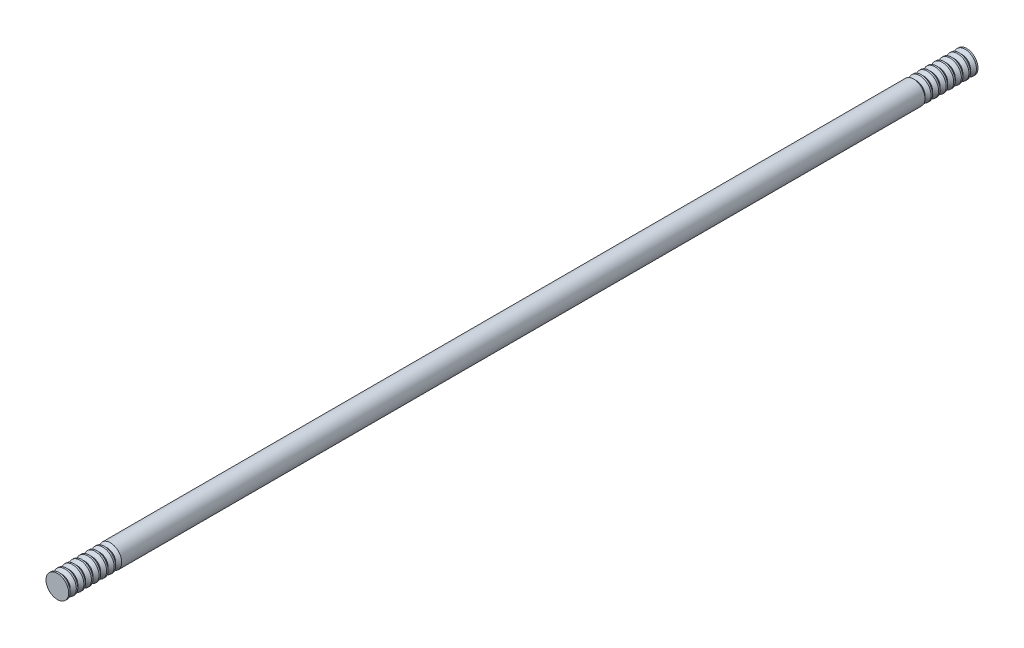
ISO-10303-21;
HEADER;
FILE_DESCRIPTION(('STEP AP214'),'2;1');
FILE_NAME('part.step','',(''),(''),'','','');
FILE_SCHEMA(('AUTOMOTIVE_DESIGN { 1 0 10303 214 1 1 1 1 }'));
ENDSEC;
DATA;
#1=APPLICATION_CONTEXT('core data for automotive mechanical design processes');
#2=APPLICATION_PROTOCOL_DEFINITION('international standard','automotive_design',2000,#1);
#3=PRODUCT_CONTEXT('',#1,'mechanical');
#4=PRODUCT('Part','Part','',(#3));
#5=PRODUCT_RELATED_PRODUCT_CATEGORY('part','',(#4));
#6=PRODUCT_DEFINITION_FORMATION('','',#4);
#7=PRODUCT_DEFINITION_CONTEXT('part definition',#1,'design');
#8=PRODUCT_DEFINITION('design','',#6,#7);
#9=PRODUCT_DEFINITION_SHAPE('','',#8);
#10=(LENGTH_UNIT() NAMED_UNIT(*) SI_UNIT(.MILLI.,.METRE.));
#11=(NAMED_UNIT(*) PLANE_ANGLE_UNIT() SI_UNIT($,.RADIAN.));
#12=(NAMED_UNIT(*) SI_UNIT($,.STERADIAN.) SOLID_ANGLE_UNIT());
#13=UNCERTAINTY_MEASURE_WITH_UNIT(LENGTH_MEASURE(1.E-05),#10,'distance_accuracy_value','');
#14=(GEOMETRIC_REPRESENTATION_CONTEXT(3) GLOBAL_UNCERTAINTY_ASSIGNED_CONTEXT((#13)) GLOBAL_UNIT_ASSIGNED_CONTEXT((#10,
#11,#12)) REPRESENTATION_CONTEXT('',''));
#15=CARTESIAN_POINT('',(0.,0.,0.));
#16=DIRECTION('',(0.,0.,1.));
#17=DIRECTION('',(1.,0.,0.));
#18=AXIS2_PLACEMENT_3D('',#15,#16,#17);
#19=CARTESIAN_POINT('',(0.,0.,60.));
#20=DIRECTION('',(0.,0.,-1.));
#21=DIRECTION('',(-1.,0.,0.));
#22=AXIS2_PLACEMENT_3D('',#19,#20,#21);
#23=CYLINDRICAL_SURFACE('',#22,1.5);
#24=CARTESIAN_POINT('',(0.,0.,53.));
#25=DIRECTION('',(0.,0.,1.));
#26=DIRECTION('',(1.,0.,0.));
#27=AXIS2_PLACEMENT_3D('',#24,#25,#26);
#28=CIRCLE('',#27,1.49999999999999);
#29=CARTESIAN_POINT('',(1.49999999999999,0.,53.));
#30=VERTEX_POINT('',#29);
#31=EDGE_CURVE('E164',#30,#30,#28,.T.);
#32=ORIENTED_EDGE('',*,*,#31,.F.);
#33=EDGE_LOOP('',(#32));
#34=FACE_BOUND('',#33,.T.);
#35=CARTESIAN_POINT('',(0.,0.,-53.));
#36=DIRECTION('',(0.,0.,1.));
#37=DIRECTION('',(1.,0.,0.));
#38=AXIS2_PLACEMENT_3D('',#35,#36,#37);
#39=CIRCLE('',#38,1.49999999999999);
#40=CARTESIAN_POINT('',(1.49999999999999,0.,-53.));
#41=VERTEX_POINT('',#40);
#42=EDGE_CURVE('E101',#41,#41,#39,.T.);
#43=ORIENTED_EDGE('',*,*,#42,.T.);
#44=EDGE_LOOP('',(#43));
#45=FACE_BOUND('',#44,.T.);
#46=ADVANCED_FACE('F35',(#34,#45),#23,.T.);
#47=CARTESIAN_POINT('',(0.,0.,-58.8));
#48=DIRECTION('',(0.,0.,1.));
#49=DIRECTION('',(1.,0.,0.));
#50=AXIS2_PLACEMENT_3D('',#47,#48,#49);
#51=CIRCLE('',#50,1.5);
#52=CARTESIAN_POINT('',(1.5,0.,-58.8));
#53=VERTEX_POINT('',#52);
#54=EDGE_CURVE('E62',#53,#53,#51,.T.);
#55=ORIENTED_EDGE('',*,*,#54,.F.);
#56=EDGE_LOOP('',(#55));
#57=FACE_BOUND('',#56,.T.);
#58=CARTESIAN_POINT('',(0.,0.,-59.));
#59=DIRECTION('',(0.,0.,1.));
#60=DIRECTION('',(1.,0.,0.));
#61=AXIS2_PLACEMENT_3D('',#58,#59,#60);
#62=CIRCLE('',#61,1.49999999999999);
#63=CARTESIAN_POINT('',(1.49999999999999,0.,-59.));
#64=VERTEX_POINT('',#63);
#65=EDGE_CURVE('E46',#64,#64,#62,.T.);
#66=ORIENTED_EDGE('',*,*,#65,.T.);
#67=EDGE_LOOP('',(#66));
#68=FACE_BOUND('',#67,.T.);
#69=ADVANCED_FACE('F193',(#57,#68),#23,.T.);
#70=CARTESIAN_POINT('',(0.,0.,-59.4));
#71=DIRECTION('',(0.,0.,1.));
#72=DIRECTION('',(1.,0.,0.));
#73=AXIS2_PLACEMENT_3D('',#70,#71,#72);
#74=CONICAL_SURFACE('',#73,1.1,0.78539816339742);
#75=ORIENTED_EDGE('',*,*,#65,.F.);
#76=EDGE_LOOP('',(#75));
#77=FACE_BOUND('',#76,.T.);
#78=CARTESIAN_POINT('',(0.,0.,-59.4));
#79=DIRECTION('',(0.,0.,1.));
#80=DIRECTION('',(1.,0.,0.));
#81=AXIS2_PLACEMENT_3D('',#78,#79,#80);
#82=CIRCLE('',#81,1.1);
#83=CARTESIAN_POINT('',(1.1,0.,-59.4));
#84=VERTEX_POINT('',#83);
#85=EDGE_CURVE('E50',#84,#84,#82,.T.);
#86=ORIENTED_EDGE('',*,*,#85,.T.);
#87=EDGE_LOOP('',(#86));
#88=FACE_BOUND('',#87,.T.);
#89=ADVANCED_FACE('F198',(#77,#88),#74,.T.);
#90=CARTESIAN_POINT('',(0.,0.,-59.8));
#91=DIRECTION('',(0.,0.,-1.));
#92=DIRECTION('',(-1.,0.,0.));
#93=AXIS2_PLACEMENT_3D('',#90,#91,#92);
#94=CONICAL_SURFACE('',#93,1.5,0.785398163397468);
#95=ORIENTED_EDGE('',*,*,#85,.F.);
#96=EDGE_LOOP('',(#95));
#97=FACE_BOUND('',#96,.T.);
#98=CARTESIAN_POINT('',(0.,0.,-59.8));
#99=DIRECTION('',(0.,0.,1.));
#100=DIRECTION('',(1.,0.,0.));
#101=AXIS2_PLACEMENT_3D('',#98,#99,#100);
#102=CIRCLE('',#101,1.5);
#103=CARTESIAN_POINT('',(1.5,0.,-59.8));
#104=VERTEX_POINT('',#103);
#105=EDGE_CURVE('E53',#104,#104,#102,.T.);
#106=ORIENTED_EDGE('',*,*,#105,.T.);
#107=EDGE_LOOP('',(#106));
#108=FACE_BOUND('',#107,.T.);
#109=ADVANCED_FACE('F217',(#97,#108),#94,.T.);
#110=CARTESIAN_POINT('',(0.,0.,-60.));
#111=DIRECTION('',(0.,0.,1.));
#112=DIRECTION('',(1.,0.,0.));
#113=AXIS2_PLACEMENT_3D('',#110,#111,#112);
#114=PLANE('',#113);
#115=CARTESIAN_POINT('',(0.,0.,-60.));
#116=DIRECTION('',(0.,0.,1.));
#117=DIRECTION('',(1.,0.,0.));
#118=AXIS2_PLACEMENT_3D('',#115,#116,#117);
#119=CIRCLE('',#118,1.5);
#120=CARTESIAN_POINT('',(1.5,0.,-60.));
#121=VERTEX_POINT('',#120);
#122=EDGE_CURVE('E39',#121,#121,#119,.T.);
#123=ORIENTED_EDGE('',*,*,#122,.F.);
#124=EDGE_LOOP('',(#123));
#125=FACE_BOUND('',#124,.T.);
#126=ADVANCED_FACE('F208',(#125),#114,.F.);
#127=ORIENTED_EDGE('',*,*,#105,.F.);
#128=EDGE_LOOP('',(#127));
#129=FACE_BOUND('',#128,.T.);
#130=ORIENTED_EDGE('',*,*,#122,.T.);
#131=EDGE_LOOP('',(#130));
#132=FACE_BOUND('',#131,.T.);
#133=ADVANCED_FACE('F37',(#129,#132),#23,.T.);
#134=CARTESIAN_POINT('',(0.,0.,-58.4));
#135=DIRECTION('',(0.,0.,1.));
#136=DIRECTION('',(1.,0.,0.));
#137=AXIS2_PLACEMENT_3D('',#134,#135,#136);
#138=CONICAL_SURFACE('',#137,1.1,0.78539816339742);
#139=CARTESIAN_POINT('',(0.,0.,-58.));
#140=DIRECTION('',(0.,0.,1.));
#141=DIRECTION('',(1.,0.,0.));
#142=AXIS2_PLACEMENT_3D('',#139,#140,#141);
#143=CIRCLE('',#142,1.49999999999999);
#144=CARTESIAN_POINT('',(1.49999999999999,0.,-58.));
#145=VERTEX_POINT('',#144);
#146=EDGE_CURVE('E56',#145,#145,#143,.T.);
#147=ORIENTED_EDGE('',*,*,#146,.F.);
#148=EDGE_LOOP('',(#147));
#149=FACE_BOUND('',#148,.T.);
#150=CARTESIAN_POINT('',(0.,0.,-58.4));
#151=DIRECTION('',(0.,0.,1.));
#152=DIRECTION('',(1.,0.,0.));
#153=AXIS2_PLACEMENT_3D('',#150,#151,#152);
#154=CIRCLE('',#153,1.1);
#155=CARTESIAN_POINT('',(1.1,0.,-58.4));
#156=VERTEX_POINT('',#155);
#157=EDGE_CURVE('E59',#156,#156,#154,.T.);
#158=ORIENTED_EDGE('',*,*,#157,.T.);
#159=EDGE_LOOP('',(#158));
#160=FACE_BOUND('',#159,.T.);
#161=ADVANCED_FACE('F207',(#149,#160),#138,.T.);
#162=CARTESIAN_POINT('',(0.,0.,-58.8));
#163=DIRECTION('',(0.,0.,-1.));
#164=DIRECTION('',(-1.,0.,0.));
#165=AXIS2_PLACEMENT_3D('',#162,#163,#164);
#166=CONICAL_SURFACE('',#165,1.5,0.785398163397468);
#167=ORIENTED_EDGE('',*,*,#157,.F.);
#168=EDGE_LOOP('',(#167));
#169=FACE_BOUND('',#168,.T.);
#170=ORIENTED_EDGE('',*,*,#54,.T.);
#171=EDGE_LOOP('',(#170));
#172=FACE_BOUND('',#171,.T.);
#173=ADVANCED_FACE('F214',(#169,#172),#166,.T.);
#174=CARTESIAN_POINT('',(0.,0.,-57.8));
#175=DIRECTION('',(0.,0.,1.));
#176=DIRECTION('',(1.,0.,0.));
#177=AXIS2_PLACEMENT_3D('',#174,#175,#176);
#178=CIRCLE('',#177,1.5);
#179=CARTESIAN_POINT('',(1.5,0.,-57.8));
#180=VERTEX_POINT('',#179);
#181=EDGE_CURVE('E71',#180,#180,#178,.T.);
#182=ORIENTED_EDGE('',*,*,#181,.F.);
#183=EDGE_LOOP('',(#182));
#184=FACE_BOUND('',#183,.T.);
#185=ORIENTED_EDGE('',*,*,#146,.T.);
#186=EDGE_LOOP('',(#185));
#187=FACE_BOUND('',#186,.T.);
#188=ADVANCED_FACE('F200',(#184,#187),#23,.T.);
#189=CARTESIAN_POINT('',(0.,0.,-57.4));
#190=DIRECTION('',(0.,0.,1.));
#191=DIRECTION('',(1.,0.,0.));
#192=AXIS2_PLACEMENT_3D('',#189,#190,#191);
#193=CONICAL_SURFACE('',#192,1.1,0.78539816339742);
#194=CARTESIAN_POINT('',(0.,0.,-57.));
#195=DIRECTION('',(0.,0.,1.));
#196=DIRECTION('',(1.,0.,0.));
#197=AXIS2_PLACEMENT_3D('',#194,#195,#196);
#198=CIRCLE('',#197,1.49999999999999);
#199=CARTESIAN_POINT('',(1.49999999999999,0.,-57.));
#200=VERTEX_POINT('',#199);
#201=EDGE_CURVE('E65',#200,#200,#198,.T.);
#202=ORIENTED_EDGE('',*,*,#201,.F.);
#203=EDGE_LOOP('',(#202));
#204=FACE_BOUND('',#203,.T.);
#205=CARTESIAN_POINT('',(0.,0.,-57.4));
#206=DIRECTION('',(0.,0.,1.));
#207=DIRECTION('',(1.,0.,0.));
#208=AXIS2_PLACEMENT_3D('',#205,#206,#207);
#209=CIRCLE('',#208,1.1);
#210=CARTESIAN_POINT('',(1.1,0.,-57.4));
#211=VERTEX_POINT('',#210);
#212=EDGE_CURVE('E68',#211,#211,#209,.T.);
#213=ORIENTED_EDGE('',*,*,#212,.T.);
#214=EDGE_LOOP('',(#213));
#215=FACE_BOUND('',#214,.T.);
#216=ADVANCED_FACE('F236',(#204,#215),#193,.T.);
#217=CARTESIAN_POINT('',(0.,0.,-57.8));
#218=DIRECTION('',(0.,0.,-1.));
#219=DIRECTION('',(-1.,0.,0.));
#220=AXIS2_PLACEMENT_3D('',#217,#218,#219);
#221=CONICAL_SURFACE('',#220,1.5,0.785398163397468);
#222=ORIENTED_EDGE('',*,*,#212,.F.);
#223=EDGE_LOOP('',(#222));
#224=FACE_BOUND('',#223,.T.);
#225=ORIENTED_EDGE('',*,*,#181,.T.);
#226=EDGE_LOOP('',(#225));
#227=FACE_BOUND('',#226,.T.);
#228=ADVANCED_FACE('F239',(#224,#227),#221,.T.);
#229=CARTESIAN_POINT('',(0.,0.,-56.8));
#230=DIRECTION('',(0.,0.,1.));
#231=DIRECTION('',(1.,0.,0.));
#232=AXIS2_PLACEMENT_3D('',#229,#230,#231);
#233=CIRCLE('',#232,1.5);
#234=CARTESIAN_POINT('',(1.5,0.,-56.8));
#235=VERTEX_POINT('',#234);
#236=EDGE_CURVE('E80',#235,#235,#233,.T.);
#237=ORIENTED_EDGE('',*,*,#236,.F.);
#238=EDGE_LOOP('',(#237));
#239=FACE_BOUND('',#238,.T.);
#240=ORIENTED_EDGE('',*,*,#201,.T.);
#241=EDGE_LOOP('',(#240));
#242=FACE_BOUND('',#241,.T.);
#243=ADVANCED_FACE('F243',(#239,#242),#23,.T.);
#244=CARTESIAN_POINT('',(0.,0.,-56.4));
#245=DIRECTION('',(0.,0.,1.));
#246=DIRECTION('',(1.,0.,0.));
#247=AXIS2_PLACEMENT_3D('',#244,#245,#246);
#248=CONICAL_SURFACE('',#247,1.1,0.78539816339742);
#249=CARTESIAN_POINT('',(0.,0.,-56.));
#250=DIRECTION('',(0.,0.,1.));
#251=DIRECTION('',(1.,0.,0.));
#252=AXIS2_PLACEMENT_3D('',#249,#250,#251);
#253=CIRCLE('',#252,1.49999999999999);
#254=CARTESIAN_POINT('',(1.49999999999999,0.,-56.));
#255=VERTEX_POINT('',#254);
#256=EDGE_CURVE('E74',#255,#255,#253,.T.);
#257=ORIENTED_EDGE('',*,*,#256,.F.);
#258=EDGE_LOOP('',(#257));
#259=FACE_BOUND('',#258,.T.);
#260=CARTESIAN_POINT('',(0.,0.,-56.4));
#261=DIRECTION('',(0.,0.,1.));
#262=DIRECTION('',(1.,0.,0.));
#263=AXIS2_PLACEMENT_3D('',#260,#261,#262);
#264=CIRCLE('',#263,1.1);
#265=CARTESIAN_POINT('',(1.1,0.,-56.4));
#266=VERTEX_POINT('',#265);
#267=EDGE_CURVE('E77',#266,#266,#264,.T.);
#268=ORIENTED_EDGE('',*,*,#267,.T.);
#269=EDGE_LOOP('',(#268));
#270=FACE_BOUND('',#269,.T.);
#271=ADVANCED_FACE('F245',(#259,#270),#248,.T.);
#272=CARTESIAN_POINT('',(0.,0.,-56.8));
#273=DIRECTION('',(0.,0.,-1.));
#274=DIRECTION('',(-1.,0.,0.));
#275=AXIS2_PLACEMENT_3D('',#272,#273,#274);
#276=CONICAL_SURFACE('',#275,1.5,0.785398163397468);
#277=ORIENTED_EDGE('',*,*,#267,.F.);
#278=EDGE_LOOP('',(#277));
#279=FACE_BOUND('',#278,.T.);
#280=ORIENTED_EDGE('',*,*,#236,.T.);
#281=EDGE_LOOP('',(#280));
#282=FACE_BOUND('',#281,.T.);
#283=ADVANCED_FACE('F248',(#279,#282),#276,.T.);
#284=CARTESIAN_POINT('',(0.,0.,-55.8));
#285=DIRECTION('',(0.,0.,1.));
#286=DIRECTION('',(1.,0.,0.));
#287=AXIS2_PLACEMENT_3D('',#284,#285,#286);
#288=CIRCLE('',#287,1.5);
#289=CARTESIAN_POINT('',(1.5,0.,-55.8));
#290=VERTEX_POINT('',#289);
#291=EDGE_CURVE('E89',#290,#290,#288,.T.);
#292=ORIENTED_EDGE('',*,*,#291,.F.);
#293=EDGE_LOOP('',(#292));
#294=FACE_BOUND('',#293,.T.);
#295=ORIENTED_EDGE('',*,*,#256,.T.);
#296=EDGE_LOOP('',(#295));
#297=FACE_BOUND('',#296,.T.);
#298=ADVANCED_FACE('F252',(#294,#297),#23,.T.);
#299=CARTESIAN_POINT('',(0.,0.,-55.4));
#300=DIRECTION('',(0.,0.,1.));
#301=DIRECTION('',(1.,0.,0.));
#302=AXIS2_PLACEMENT_3D('',#299,#300,#301);
#303=CONICAL_SURFACE('',#302,1.1,0.78539816339742);
#304=CARTESIAN_POINT('',(0.,0.,-55.));
#305=DIRECTION('',(0.,0.,1.));
#306=DIRECTION('',(1.,0.,0.));
#307=AXIS2_PLACEMENT_3D('',#304,#305,#306);
#308=CIRCLE('',#307,1.49999999999999);
#309=CARTESIAN_POINT('',(1.49999999999999,0.,-55.));
#310=VERTEX_POINT('',#309);
#311=EDGE_CURVE('E83',#310,#310,#308,.T.);
#312=ORIENTED_EDGE('',*,*,#311,.F.);
#313=EDGE_LOOP('',(#312));
#314=FACE_BOUND('',#313,.T.);
#315=CARTESIAN_POINT('',(0.,0.,-55.4));
#316=DIRECTION('',(0.,0.,1.));
#317=DIRECTION('',(1.,0.,0.));
#318=AXIS2_PLACEMENT_3D('',#315,#316,#317);
#319=CIRCLE('',#318,1.1);
#320=CARTESIAN_POINT('',(1.1,0.,-55.4));
#321=VERTEX_POINT('',#320);
#322=EDGE_CURVE('E86',#321,#321,#319,.T.);
#323=ORIENTED_EDGE('',*,*,#322,.T.);
#324=EDGE_LOOP('',(#323));
#325=FACE_BOUND('',#324,.T.);
#326=ADVANCED_FACE('F254',(#314,#325),#303,.T.);
#327=CARTESIAN_POINT('',(0.,0.,-55.8));
#328=DIRECTION('',(0.,0.,-1.));
#329=DIRECTION('',(-1.,0.,0.));
#330=AXIS2_PLACEMENT_3D('',#327,#328,#329);
#331=CONICAL_SURFACE('',#330,1.5,0.785398163397468);
#332=ORIENTED_EDGE('',*,*,#322,.F.);
#333=EDGE_LOOP('',(#332));
#334=FACE_BOUND('',#333,.T.);
#335=ORIENTED_EDGE('',*,*,#291,.T.);
#336=EDGE_LOOP('',(#335));
#337=FACE_BOUND('',#336,.T.);
#338=ADVANCED_FACE('F257',(#334,#337),#331,.T.);
#339=CARTESIAN_POINT('',(0.,0.,-54.8));
#340=DIRECTION('',(0.,0.,1.));
#341=DIRECTION('',(1.,0.,0.));
#342=AXIS2_PLACEMENT_3D('',#339,#340,#341);
#343=CIRCLE('',#342,1.5);
#344=CARTESIAN_POINT('',(1.5,0.,-54.8));
#345=VERTEX_POINT('',#344);
#346=EDGE_CURVE('E98',#345,#345,#343,.T.);
#347=ORIENTED_EDGE('',*,*,#346,.F.);
#348=EDGE_LOOP('',(#347));
#349=FACE_BOUND('',#348,.T.);
#350=ORIENTED_EDGE('',*,*,#311,.T.);
#351=EDGE_LOOP('',(#350));
#352=FACE_BOUND('',#351,.T.);
#353=ADVANCED_FACE('F261',(#349,#352),#23,.T.);
#354=CARTESIAN_POINT('',(0.,0.,-54.4));
#355=DIRECTION('',(0.,0.,1.));
#356=DIRECTION('',(1.,0.,0.));
#357=AXIS2_PLACEMENT_3D('',#354,#355,#356);
#358=CONICAL_SURFACE('',#357,1.1,0.78539816339742);
#359=CARTESIAN_POINT('',(0.,0.,-54.));
#360=DIRECTION('',(0.,0.,1.));
#361=DIRECTION('',(1.,0.,0.));
#362=AXIS2_PLACEMENT_3D('',#359,#360,#361);
#363=CIRCLE('',#362,1.49999999999999);
#364=CARTESIAN_POINT('',(1.49999999999999,0.,-54.));
#365=VERTEX_POINT('',#364);
#366=EDGE_CURVE('E92',#365,#365,#363,.T.);
#367=ORIENTED_EDGE('',*,*,#366,.F.);
#368=EDGE_LOOP('',(#367));
#369=FACE_BOUND('',#368,.T.);
#370=CARTESIAN_POINT('',(0.,0.,-54.4));
#371=DIRECTION('',(0.,0.,1.));
#372=DIRECTION('',(1.,0.,0.));
#373=AXIS2_PLACEMENT_3D('',#370,#371,#372);
#374=CIRCLE('',#373,1.1);
#375=CARTESIAN_POINT('',(1.1,0.,-54.4));
#376=VERTEX_POINT('',#375);
#377=EDGE_CURVE('E95',#376,#376,#374,.T.);
#378=ORIENTED_EDGE('',*,*,#377,.T.);
#379=EDGE_LOOP('',(#378));
#380=FACE_BOUND('',#379,.T.);
#381=ADVANCED_FACE('F263',(#369,#380),#358,.T.);
#382=CARTESIAN_POINT('',(0.,0.,-54.8));
#383=DIRECTION('',(0.,0.,-1.));
#384=DIRECTION('',(-1.,0.,0.));
#385=AXIS2_PLACEMENT_3D('',#382,#383,#384);
#386=CONICAL_SURFACE('',#385,1.5,0.785398163397468);
#387=ORIENTED_EDGE('',*,*,#377,.F.);
#388=EDGE_LOOP('',(#387));
#389=FACE_BOUND('',#388,.T.);
#390=ORIENTED_EDGE('',*,*,#346,.T.);
#391=EDGE_LOOP('',(#390));
#392=FACE_BOUND('',#391,.T.);
#393=ADVANCED_FACE('F266',(#389,#392),#386,.T.);
#394=CARTESIAN_POINT('',(0.,0.,-53.8));
#395=DIRECTION('',(0.,0.,1.));
#396=DIRECTION('',(1.,0.,0.));
#397=AXIS2_PLACEMENT_3D('',#394,#395,#396);
#398=CIRCLE('',#397,1.5);
#399=CARTESIAN_POINT('',(1.5,0.,-53.8));
#400=VERTEX_POINT('',#399);
#401=EDGE_CURVE('E107',#400,#400,#398,.T.);
#402=ORIENTED_EDGE('',*,*,#401,.F.);
#403=EDGE_LOOP('',(#402));
#404=FACE_BOUND('',#403,.T.);
#405=ORIENTED_EDGE('',*,*,#366,.T.);
#406=EDGE_LOOP('',(#405));
#407=FACE_BOUND('',#406,.T.);
#408=ADVANCED_FACE('F270',(#404,#407),#23,.T.);
#409=CARTESIAN_POINT('',(0.,0.,-53.4));
#410=DIRECTION('',(0.,0.,1.));
#411=DIRECTION('',(1.,0.,0.));
#412=AXIS2_PLACEMENT_3D('',#409,#410,#411);
#413=CONICAL_SURFACE('',#412,1.1,0.78539816339742);
#414=ORIENTED_EDGE('',*,*,#42,.F.);
#415=EDGE_LOOP('',(#414));
#416=FACE_BOUND('',#415,.T.);
#417=CARTESIAN_POINT('',(0.,0.,-53.4));
#418=DIRECTION('',(0.,0.,1.));
#419=DIRECTION('',(1.,0.,0.));
#420=AXIS2_PLACEMENT_3D('',#417,#418,#419);
#421=CIRCLE('',#420,1.1);
#422=CARTESIAN_POINT('',(1.1,0.,-53.4));
#423=VERTEX_POINT('',#422);
#424=EDGE_CURVE('E104',#423,#423,#421,.T.);
#425=ORIENTED_EDGE('',*,*,#424,.T.);
#426=EDGE_LOOP('',(#425));
#427=FACE_BOUND('',#426,.T.);
#428=ADVANCED_FACE('F272',(#416,#427),#413,.T.);
#429=CARTESIAN_POINT('',(0.,0.,-53.8));
#430=DIRECTION('',(0.,0.,-1.));
#431=DIRECTION('',(-1.,0.,0.));
#432=AXIS2_PLACEMENT_3D('',#429,#430,#431);
#433=CONICAL_SURFACE('',#432,1.5,0.785398163397468);
#434=ORIENTED_EDGE('',*,*,#424,.F.);
#435=EDGE_LOOP('',(#434));
#436=FACE_BOUND('',#435,.T.);
#437=ORIENTED_EDGE('',*,*,#401,.T.);
#438=EDGE_LOOP('',(#437));
#439=FACE_BOUND('',#438,.T.);
#440=ADVANCED_FACE('F189',(#436,#439),#433,.T.);
#441=CARTESIAN_POINT('',(0.,0.,53.4));
#442=DIRECTION('',(0.,0.,-1.));
#443=DIRECTION('',(1.,0.,0.));
#444=AXIS2_PLACEMENT_3D('',#441,#442,#443);
#445=CONICAL_SURFACE('',#444,1.1,0.78539816339742);
#446=ORIENTED_EDGE('',*,*,#31,.T.);
#447=EDGE_LOOP('',(#446));
#448=FACE_BOUND('',#447,.T.);
#449=CARTESIAN_POINT('',(0.,0.,53.4));
#450=DIRECTION('',(0.,0.,1.));
#451=DIRECTION('',(1.,0.,0.));
#452=AXIS2_PLACEMENT_3D('',#449,#450,#451);
#453=CIRCLE('',#452,1.1);
#454=CARTESIAN_POINT('',(1.1,0.,53.4));
#455=VERTEX_POINT('',#454);
#456=EDGE_CURVE('E167',#455,#455,#453,.T.);
#457=ORIENTED_EDGE('',*,*,#456,.F.);
#458=EDGE_LOOP('',(#457));
#459=FACE_BOUND('',#458,.T.);
#460=ADVANCED_FACE('F180',(#448,#459),#445,.T.);
#461=CARTESIAN_POINT('',(0.,0.,53.8));
#462=DIRECTION('',(0.,0.,1.));
#463=DIRECTION('',(-1.,0.,0.));
#464=AXIS2_PLACEMENT_3D('',#461,#462,#463);
#465=CONICAL_SURFACE('',#464,1.5,0.785398163397468);
#466=ORIENTED_EDGE('',*,*,#456,.T.);
#467=EDGE_LOOP('',(#466));
#468=FACE_BOUND('',#467,.T.);
#469=CARTESIAN_POINT('',(0.,0.,53.8));
#470=DIRECTION('',(0.,0.,1.));
#471=DIRECTION('',(1.,0.,0.));
#472=AXIS2_PLACEMENT_3D('',#469,#470,#471);
#473=CIRCLE('',#472,1.5);
#474=CARTESIAN_POINT('',(1.5,0.,53.8));
#475=VERTEX_POINT('',#474);
#476=EDGE_CURVE('E170',#475,#475,#473,.T.);
#477=ORIENTED_EDGE('',*,*,#476,.F.);
#478=EDGE_LOOP('',(#477));
#479=FACE_BOUND('',#478,.T.);
#480=ADVANCED_FACE('F177',(#468,#479),#465,.T.);
#481=CARTESIAN_POINT('',(0.,0.,60.));
#482=DIRECTION('',(0.,0.,1.));
#483=DIRECTION('',(1.,0.,0.));
#484=AXIS2_PLACEMENT_3D('',#481,#482,#483);
#485=PLANE('',#484);
#486=CARTESIAN_POINT('',(0.,0.,60.));
#487=DIRECTION('',(0.,0.,1.));
#488=DIRECTION('',(1.,0.,0.));
#489=AXIS2_PLACEMENT_3D('',#486,#487,#488);
#490=CIRCLE('',#489,1.5);
#491=CARTESIAN_POINT('',(1.5,0.,60.));
#492=VERTEX_POINT('',#491);
#493=EDGE_CURVE('E10',#492,#492,#490,.T.);
#494=ORIENTED_EDGE('',*,*,#493,.T.);
#495=EDGE_LOOP('',(#494));
#496=FACE_BOUND('',#495,.T.);
#497=ADVANCED_FACE('F179',(#496),#485,.T.);
#498=CARTESIAN_POINT('',(0.,0.,59.8));
#499=DIRECTION('',(0.,0.,1.));
#500=DIRECTION('',(1.,0.,0.));
#501=AXIS2_PLACEMENT_3D('',#498,#499,#500);
#502=CIRCLE('',#501,1.5);
#503=CARTESIAN_POINT('',(1.5,0.,59.8));
#504=VERTEX_POINT('',#503);
#505=EDGE_CURVE('E116',#504,#504,#502,.T.);
#506=ORIENTED_EDGE('',*,*,#505,.T.);
#507=EDGE_LOOP('',(#506));
#508=FACE_BOUND('',#507,.T.);
#509=ORIENTED_EDGE('',*,*,#493,.F.);
#510=EDGE_LOOP('',(#509));
#511=FACE_BOUND('',#510,.T.);
#512=ADVANCED_FACE('F187',(#508,#511),#23,.T.);
#513=CARTESIAN_POINT('',(0.,0.,59.8));
#514=DIRECTION('',(0.,0.,1.));
#515=DIRECTION('',(-1.,0.,0.));
#516=AXIS2_PLACEMENT_3D('',#513,#514,#515);
#517=CONICAL_SURFACE('',#516,1.5,0.785398163397468);
#518=CARTESIAN_POINT('',(0.,0.,59.4));
#519=DIRECTION('',(0.,0.,1.));
#520=DIRECTION('',(1.,0.,0.));
#521=AXIS2_PLACEMENT_3D('',#518,#519,#520);
#522=CIRCLE('',#521,1.1);
#523=CARTESIAN_POINT('',(1.1,0.,59.4));
#524=VERTEX_POINT('',#523);
#525=EDGE_CURVE('E113',#524,#524,#522,.T.);
#526=ORIENTED_EDGE('',*,*,#525,.T.);
#527=EDGE_LOOP('',(#526));
#528=FACE_BOUND('',#527,.T.);
#529=ORIENTED_EDGE('',*,*,#505,.F.);
#530=EDGE_LOOP('',(#529));
#531=FACE_BOUND('',#530,.T.);
#532=ADVANCED_FACE('F283',(#528,#531),#517,.T.);
#533=CARTESIAN_POINT('',(0.,0.,59.4));
#534=DIRECTION('',(0.,0.,-1.));
#535=DIRECTION('',(1.,0.,0.));
#536=AXIS2_PLACEMENT_3D('',#533,#534,#535);
#537=CONICAL_SURFACE('',#536,1.1,0.78539816339742);
#538=CARTESIAN_POINT('',(0.,0.,59.));
#539=DIRECTION('',(0.,0.,1.));
#540=DIRECTION('',(1.,0.,0.));
#541=AXIS2_PLACEMENT_3D('',#538,#539,#540);
#542=CIRCLE('',#541,1.49999999999999);
#543=CARTESIAN_POINT('',(1.49999999999999,0.,59.));
#544=VERTEX_POINT('',#543);
#545=EDGE_CURVE('E110',#544,#544,#542,.T.);
#546=ORIENTED_EDGE('',*,*,#545,.T.);
#547=EDGE_LOOP('',(#546));
#548=FACE_BOUND('',#547,.T.);
#549=ORIENTED_EDGE('',*,*,#525,.F.);
#550=EDGE_LOOP('',(#549));
#551=FACE_BOUND('',#550,.T.);
#552=ADVANCED_FACE('F279',(#548,#551),#537,.T.);
#553=CARTESIAN_POINT('',(0.,0.,58.8));
#554=DIRECTION('',(0.,0.,1.));
#555=DIRECTION('',(1.,0.,0.));
#556=AXIS2_PLACEMENT_3D('',#553,#554,#555);
#557=CIRCLE('',#556,1.5);
#558=CARTESIAN_POINT('',(1.5,0.,58.8));
#559=VERTEX_POINT('',#558);
#560=EDGE_CURVE('E125',#559,#559,#557,.T.);
#561=ORIENTED_EDGE('',*,*,#560,.T.);
#562=EDGE_LOOP('',(#561));
#563=FACE_BOUND('',#562,.T.);
#564=ORIENTED_EDGE('',*,*,#545,.F.);
#565=EDGE_LOOP('',(#564));
#566=FACE_BOUND('',#565,.T.);
#567=ADVANCED_FACE('F282',(#563,#566),#23,.T.);
#568=CARTESIAN_POINT('',(0.,0.,58.8));
#569=DIRECTION('',(0.,0.,1.));
#570=DIRECTION('',(-1.,0.,0.));
#571=AXIS2_PLACEMENT_3D('',#568,#569,#570);
#572=CONICAL_SURFACE('',#571,1.5,0.785398163397468);
#573=CARTESIAN_POINT('',(0.,0.,58.4));
#574=DIRECTION('',(0.,0.,1.));
#575=DIRECTION('',(1.,0.,0.));
#576=AXIS2_PLACEMENT_3D('',#573,#574,#575);
#577=CIRCLE('',#576,1.1);
#578=CARTESIAN_POINT('',(1.1,0.,58.4));
#579=VERTEX_POINT('',#578);
#580=EDGE_CURVE('E122',#579,#579,#577,.T.);
#581=ORIENTED_EDGE('',*,*,#580,.T.);
#582=EDGE_LOOP('',(#581));
#583=FACE_BOUND('',#582,.T.);
#584=ORIENTED_EDGE('',*,*,#560,.F.);
#585=EDGE_LOOP('',(#584));
#586=FACE_BOUND('',#585,.T.);
#587=ADVANCED_FACE('F292',(#583,#586),#572,.T.);
#588=CARTESIAN_POINT('',(0.,0.,58.4));
#589=DIRECTION('',(0.,0.,-1.));
#590=DIRECTION('',(1.,0.,0.));
#591=AXIS2_PLACEMENT_3D('',#588,#589,#590);
#592=CONICAL_SURFACE('',#591,1.1,0.78539816339742);
#593=CARTESIAN_POINT('',(0.,0.,58.));
#594=DIRECTION('',(0.,0.,1.));
#595=DIRECTION('',(1.,0.,0.));
#596=AXIS2_PLACEMENT_3D('',#593,#594,#595);
#597=CIRCLE('',#596,1.49999999999999);
#598=CARTESIAN_POINT('',(1.49999999999999,0.,58.));
#599=VERTEX_POINT('',#598);
#600=EDGE_CURVE('E119',#599,#599,#597,.T.);
#601=ORIENTED_EDGE('',*,*,#600,.T.);
#602=EDGE_LOOP('',(#601));
#603=FACE_BOUND('',#602,.T.);
#604=ORIENTED_EDGE('',*,*,#580,.F.);
#605=EDGE_LOOP('',(#604));
#606=FACE_BOUND('',#605,.T.);
#607=ADVANCED_FACE('F288',(#603,#606),#592,.T.);
#608=CARTESIAN_POINT('',(0.,0.,57.8));
#609=DIRECTION('',(0.,0.,1.));
#610=DIRECTION('',(1.,0.,0.));
#611=AXIS2_PLACEMENT_3D('',#608,#609,#610);
#612=CIRCLE('',#611,1.5);
#613=CARTESIAN_POINT('',(1.5,0.,57.8));
#614=VERTEX_POINT('',#613);
#615=EDGE_CURVE('E134',#614,#614,#612,.T.);
#616=ORIENTED_EDGE('',*,*,#615,.T.);
#617=EDGE_LOOP('',(#616));
#618=FACE_BOUND('',#617,.T.);
#619=ORIENTED_EDGE('',*,*,#600,.F.);
#620=EDGE_LOOP('',(#619));
#621=FACE_BOUND('',#620,.T.);
#622=ADVANCED_FACE('F291',(#618,#621),#23,.T.);
#623=CARTESIAN_POINT('',(0.,0.,57.8));
#624=DIRECTION('',(0.,0.,1.));
#625=DIRECTION('',(-1.,0.,0.));
#626=AXIS2_PLACEMENT_3D('',#623,#624,#625);
#627=CONICAL_SURFACE('',#626,1.5,0.785398163397468);
#628=CARTESIAN_POINT('',(0.,0.,57.4));
#629=DIRECTION('',(0.,0.,1.));
#630=DIRECTION('',(1.,0.,0.));
#631=AXIS2_PLACEMENT_3D('',#628,#629,#630);
#632=CIRCLE('',#631,1.1);
#633=CARTESIAN_POINT('',(1.1,0.,57.4));
#634=VERTEX_POINT('',#633);
#635=EDGE_CURVE('E131',#634,#634,#632,.T.);
#636=ORIENTED_EDGE('',*,*,#635,.T.);
#637=EDGE_LOOP('',(#636));
#638=FACE_BOUND('',#637,.T.);
#639=ORIENTED_EDGE('',*,*,#615,.F.);
#640=EDGE_LOOP('',(#639));
#641=FACE_BOUND('',#640,.T.);
#642=ADVANCED_FACE('F301',(#638,#641),#627,.T.);
#643=CARTESIAN_POINT('',(0.,0.,57.4));
#644=DIRECTION('',(0.,0.,-1.));
#645=DIRECTION('',(1.,0.,0.));
#646=AXIS2_PLACEMENT_3D('',#643,#644,#645);
#647=CONICAL_SURFACE('',#646,1.1,0.78539816339742);
#648=CARTESIAN_POINT('',(0.,0.,57.));
#649=DIRECTION('',(0.,0.,1.));
#650=DIRECTION('',(1.,0.,0.));
#651=AXIS2_PLACEMENT_3D('',#648,#649,#650);
#652=CIRCLE('',#651,1.49999999999999);
#653=CARTESIAN_POINT('',(1.49999999999999,0.,57.));
#654=VERTEX_POINT('',#653);
#655=EDGE_CURVE('E128',#654,#654,#652,.T.);
#656=ORIENTED_EDGE('',*,*,#655,.T.);
#657=EDGE_LOOP('',(#656));
#658=FACE_BOUND('',#657,.T.);
#659=ORIENTED_EDGE('',*,*,#635,.F.);
#660=EDGE_LOOP('',(#659));
#661=FACE_BOUND('',#660,.T.);
#662=ADVANCED_FACE('F297',(#658,#661),#647,.T.);
#663=CARTESIAN_POINT('',(0.,0.,56.8));
#664=DIRECTION('',(0.,0.,1.));
#665=DIRECTION('',(1.,0.,0.));
#666=AXIS2_PLACEMENT_3D('',#663,#664,#665);
#667=CIRCLE('',#666,1.5);
#668=CARTESIAN_POINT('',(1.5,0.,56.8));
#669=VERTEX_POINT('',#668);
#670=EDGE_CURVE('E143',#669,#669,#667,.T.);
#671=ORIENTED_EDGE('',*,*,#670,.T.);
#672=EDGE_LOOP('',(#671));
#673=FACE_BOUND('',#672,.T.);
#674=ORIENTED_EDGE('',*,*,#655,.F.);
#675=EDGE_LOOP('',(#674));
#676=FACE_BOUND('',#675,.T.);
#677=ADVANCED_FACE('F300',(#673,#676),#23,.T.);
#678=CARTESIAN_POINT('',(0.,0.,56.8));
#679=DIRECTION('',(0.,0.,1.));
#680=DIRECTION('',(-1.,0.,0.));
#681=AXIS2_PLACEMENT_3D('',#678,#679,#680);
#682=CONICAL_SURFACE('',#681,1.5,0.785398163397468);
#683=CARTESIAN_POINT('',(0.,0.,56.4));
#684=DIRECTION('',(0.,0.,1.));
#685=DIRECTION('',(1.,0.,0.));
#686=AXIS2_PLACEMENT_3D('',#683,#684,#685);
#687=CIRCLE('',#686,1.1);
#688=CARTESIAN_POINT('',(1.1,0.,56.4));
#689=VERTEX_POINT('',#688);
#690=EDGE_CURVE('E140',#689,#689,#687,.T.);
#691=ORIENTED_EDGE('',*,*,#690,.T.);
#692=EDGE_LOOP('',(#691));
#693=FACE_BOUND('',#692,.T.);
#694=ORIENTED_EDGE('',*,*,#670,.F.);
#695=EDGE_LOOP('',(#694));
#696=FACE_BOUND('',#695,.T.);
#697=ADVANCED_FACE('F310',(#693,#696),#682,.T.);
#698=CARTESIAN_POINT('',(0.,0.,56.4));
#699=DIRECTION('',(0.,0.,-1.));
#700=DIRECTION('',(1.,0.,0.));
#701=AXIS2_PLACEMENT_3D('',#698,#699,#700);
#702=CONICAL_SURFACE('',#701,1.1,0.78539816339742);
#703=CARTESIAN_POINT('',(0.,0.,56.));
#704=DIRECTION('',(0.,0.,1.));
#705=DIRECTION('',(1.,0.,0.));
#706=AXIS2_PLACEMENT_3D('',#703,#704,#705);
#707=CIRCLE('',#706,1.49999999999999);
#708=CARTESIAN_POINT('',(1.49999999999999,0.,56.));
#709=VERTEX_POINT('',#708);
#710=EDGE_CURVE('E137',#709,#709,#707,.T.);
#711=ORIENTED_EDGE('',*,*,#710,.T.);
#712=EDGE_LOOP('',(#711));
#713=FACE_BOUND('',#712,.T.);
#714=ORIENTED_EDGE('',*,*,#690,.F.);
#715=EDGE_LOOP('',(#714));
#716=FACE_BOUND('',#715,.T.);
#717=ADVANCED_FACE('F306',(#713,#716),#702,.T.);
#718=CARTESIAN_POINT('',(0.,0.,55.8));
#719=DIRECTION('',(0.,0.,1.));
#720=DIRECTION('',(1.,0.,0.));
#721=AXIS2_PLACEMENT_3D('',#718,#719,#720);
#722=CIRCLE('',#721,1.5);
#723=CARTESIAN_POINT('',(1.5,0.,55.8));
#724=VERTEX_POINT('',#723);
#725=EDGE_CURVE('E152',#724,#724,#722,.T.);
#726=ORIENTED_EDGE('',*,*,#725,.T.);
#727=EDGE_LOOP('',(#726));
#728=FACE_BOUND('',#727,.T.);
#729=ORIENTED_EDGE('',*,*,#710,.F.);
#730=EDGE_LOOP('',(#729));
#731=FACE_BOUND('',#730,.T.);
#732=ADVANCED_FACE('F309',(#728,#731),#23,.T.);
#733=CARTESIAN_POINT('',(0.,0.,55.8));
#734=DIRECTION('',(0.,0.,1.));
#735=DIRECTION('',(-1.,0.,0.));
#736=AXIS2_PLACEMENT_3D('',#733,#734,#735);
#737=CONICAL_SURFACE('',#736,1.5,0.785398163397468);
#738=CARTESIAN_POINT('',(0.,0.,55.4));
#739=DIRECTION('',(0.,0.,1.));
#740=DIRECTION('',(1.,0.,0.));
#741=AXIS2_PLACEMENT_3D('',#738,#739,#740);
#742=CIRCLE('',#741,1.1);
#743=CARTESIAN_POINT('',(1.1,0.,55.4));
#744=VERTEX_POINT('',#743);
#745=EDGE_CURVE('E149',#744,#744,#742,.T.);
#746=ORIENTED_EDGE('',*,*,#745,.T.);
#747=EDGE_LOOP('',(#746));
#748=FACE_BOUND('',#747,.T.);
#749=ORIENTED_EDGE('',*,*,#725,.F.);
#750=EDGE_LOOP('',(#749));
#751=FACE_BOUND('',#750,.T.);
#752=ADVANCED_FACE('F318',(#748,#751),#737,.T.);
#753=CARTESIAN_POINT('',(0.,0.,55.4));
#754=DIRECTION('',(0.,0.,-1.));
#755=DIRECTION('',(1.,0.,0.));
#756=AXIS2_PLACEMENT_3D('',#753,#754,#755);
#757=CONICAL_SURFACE('',#756,1.1,0.78539816339742);
#758=CARTESIAN_POINT('',(0.,0.,55.));
#759=DIRECTION('',(0.,0.,1.));
#760=DIRECTION('',(1.,0.,0.));
#761=AXIS2_PLACEMENT_3D('',#758,#759,#760);
#762=CIRCLE('',#761,1.49999999999999);
#763=CARTESIAN_POINT('',(1.49999999999999,0.,55.));
#764=VERTEX_POINT('',#763);
#765=EDGE_CURVE('E146',#764,#764,#762,.T.);
#766=ORIENTED_EDGE('',*,*,#765,.T.);
#767=EDGE_LOOP('',(#766));
#768=FACE_BOUND('',#767,.T.);
#769=ORIENTED_EDGE('',*,*,#745,.F.);
#770=EDGE_LOOP('',(#769));
#771=FACE_BOUND('',#770,.T.);
#772=ADVANCED_FACE('F315',(#768,#771),#757,.T.);
#773=CARTESIAN_POINT('',(0.,0.,54.8));
#774=DIRECTION('',(0.,0.,1.));
#775=DIRECTION('',(1.,0.,0.));
#776=AXIS2_PLACEMENT_3D('',#773,#774,#775);
#777=CIRCLE('',#776,1.5);
#778=CARTESIAN_POINT('',(1.5,0.,54.8));
#779=VERTEX_POINT('',#778);
#780=EDGE_CURVE('E161',#779,#779,#777,.T.);
#781=ORIENTED_EDGE('',*,*,#780,.T.);
#782=EDGE_LOOP('',(#781));
#783=FACE_BOUND('',#782,.T.);
#784=ORIENTED_EDGE('',*,*,#765,.F.);
#785=EDGE_LOOP('',(#784));
#786=FACE_BOUND('',#785,.T.);
#787=ADVANCED_FACE('F205',(#783,#786),#23,.T.);
#788=CARTESIAN_POINT('',(0.,0.,54.8));
#789=DIRECTION('',(0.,0.,1.));
#790=DIRECTION('',(-1.,0.,0.));
#791=AXIS2_PLACEMENT_3D('',#788,#789,#790);
#792=CONICAL_SURFACE('',#791,1.5,0.785398163397468);
#793=CARTESIAN_POINT('',(0.,0.,54.4));
#794=DIRECTION('',(0.,0.,1.));
#795=DIRECTION('',(1.,0.,0.));
#796=AXIS2_PLACEMENT_3D('',#793,#794,#795);
#797=CIRCLE('',#796,1.1);
#798=CARTESIAN_POINT('',(1.1,0.,54.4));
#799=VERTEX_POINT('',#798);
#800=EDGE_CURVE('E158',#799,#799,#797,.T.);
#801=ORIENTED_EDGE('',*,*,#800,.T.);
#802=EDGE_LOOP('',(#801));
#803=FACE_BOUND('',#802,.T.);
#804=ORIENTED_EDGE('',*,*,#780,.F.);
#805=EDGE_LOOP('',(#804));
#806=FACE_BOUND('',#805,.T.);
#807=ADVANCED_FACE('F325',(#803,#806),#792,.T.);
#808=CARTESIAN_POINT('',(0.,0.,54.4));
#809=DIRECTION('',(0.,0.,-1.));
#810=DIRECTION('',(1.,0.,0.));
#811=AXIS2_PLACEMENT_3D('',#808,#809,#810);
#812=CONICAL_SURFACE('',#811,1.1,0.78539816339742);
#813=CARTESIAN_POINT('',(0.,0.,54.));
#814=DIRECTION('',(0.,0.,1.));
#815=DIRECTION('',(1.,0.,0.));
#816=AXIS2_PLACEMENT_3D('',#813,#814,#815);
#817=CIRCLE('',#816,1.49999999999999);
#818=CARTESIAN_POINT('',(1.49999999999999,0.,54.));
#819=VERTEX_POINT('',#818);
#820=EDGE_CURVE('E155',#819,#819,#817,.T.);
#821=ORIENTED_EDGE('',*,*,#820,.T.);
#822=EDGE_LOOP('',(#821));
#823=FACE_BOUND('',#822,.T.);
#824=ORIENTED_EDGE('',*,*,#800,.F.);
#825=EDGE_LOOP('',(#824));
#826=FACE_BOUND('',#825,.T.);
#827=ADVANCED_FACE('F204',(#823,#826),#812,.T.);
#828=ORIENTED_EDGE('',*,*,#476,.T.);
#829=EDGE_LOOP('',(#828));
#830=FACE_BOUND('',#829,.T.);
#831=ORIENTED_EDGE('',*,*,#820,.F.);
#832=EDGE_LOOP('',(#831));
#833=FACE_BOUND('',#832,.T.);
#834=ADVANCED_FACE('F174',(#830,#833),#23,.T.);
#835=CLOSED_SHELL('',(#46,#69,#89,#109,#126,#133,#161,#173,#188,#216,#228,#243,#271,#283,#298,
#326,#338,#353,#381,#393,#408,#428,#440,#460,#480,#497,#512,#532,#552,#567,#587,#607,#622,#642,
#662,#677,#697,#717,#732,#752,#772,#787,#807,#827,#834));
#836=MANIFOLD_SOLID_BREP('B2',#835);
#837=ADVANCED_BREP_SHAPE_REPRESENTATION('',(#18,#836),#14);
#838=SHAPE_DEFINITION_REPRESENTATION(#9,#837);
ENDSEC;
END-ISO-10303-21;
